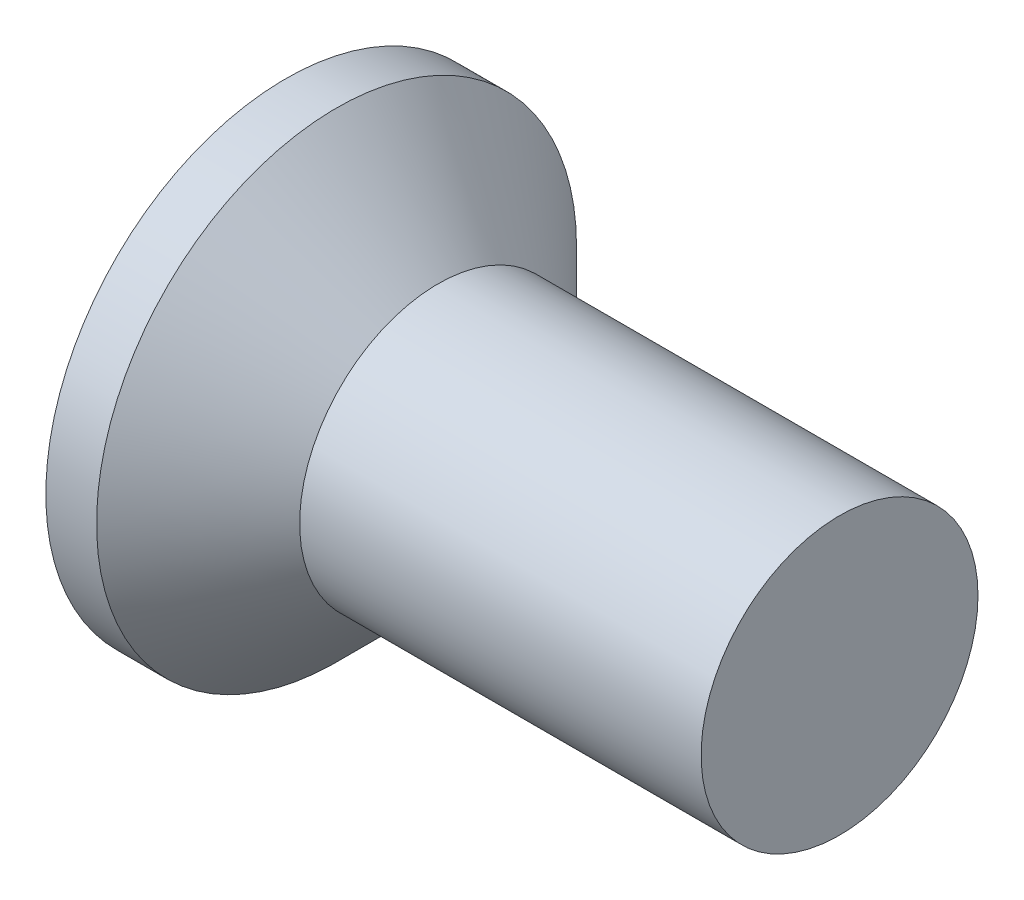
ISO-10303-21;
HEADER;
FILE_DESCRIPTION(('STEP AP214'),'2;1');
FILE_NAME('part.step','',(''),(''),'','','');
FILE_SCHEMA(('AUTOMOTIVE_DESIGN { 1 0 10303 214 1 1 1 1 }'));
ENDSEC;
DATA;
#1=APPLICATION_CONTEXT('core data for automotive mechanical design processes');
#2=APPLICATION_PROTOCOL_DEFINITION('international standard','automotive_design',2000,#1);
#3=PRODUCT_CONTEXT('',#1,'mechanical');
#4=PRODUCT('Part','Part','',(#3));
#5=PRODUCT_RELATED_PRODUCT_CATEGORY('part','',(#4));
#6=PRODUCT_DEFINITION_FORMATION('','',#4);
#7=PRODUCT_DEFINITION_CONTEXT('part definition',#1,'design');
#8=PRODUCT_DEFINITION('design','',#6,#7);
#9=PRODUCT_DEFINITION_SHAPE('','',#8);
#10=(LENGTH_UNIT() NAMED_UNIT(*) SI_UNIT(.MILLI.,.METRE.));
#11=(NAMED_UNIT(*) PLANE_ANGLE_UNIT() SI_UNIT($,.RADIAN.));
#12=(NAMED_UNIT(*) SI_UNIT($,.STERADIAN.) SOLID_ANGLE_UNIT());
#13=UNCERTAINTY_MEASURE_WITH_UNIT(LENGTH_MEASURE(1.E-05),#10,'distance_accuracy_value','');
#14=(GEOMETRIC_REPRESENTATION_CONTEXT(3) GLOBAL_UNCERTAINTY_ASSIGNED_CONTEXT((#13)) GLOBAL_UNIT_ASSIGNED_CONTEXT((#10,
#11,#12)) REPRESENTATION_CONTEXT('',''));
#15=CARTESIAN_POINT('',(0.,0.,0.));
#16=DIRECTION('',(0.,0.,1.));
#17=DIRECTION('',(1.,0.,0.));
#18=AXIS2_PLACEMENT_3D('',#15,#16,#17);
#19=CARTESIAN_POINT('',(0.,2.6,0.));
#20=DIRECTION('',(-1.,0.,0.));
#21=DIRECTION('',(0.,0.,1.));
#22=AXIS2_PLACEMENT_3D('',#19,#20,#21);
#23=PLANE('',#22);
#24=CARTESIAN_POINT('',(0.,0.,0.));
#25=DIRECTION('',(1.,0.,0.));
#26=DIRECTION('',(0.,0.,-1.));
#27=AXIS2_PLACEMENT_3D('',#24,#25,#26);
#28=CIRCLE('',#27,2.6);
#29=CARTESIAN_POINT('',(0.,0.,-2.6));
#30=VERTEX_POINT('',#29);
#31=EDGE_CURVE('E182',#30,#30,#28,.T.);
#32=ORIENTED_EDGE('',*,*,#31,.F.);
#33=EDGE_LOOP('',(#32));
#34=FACE_BOUND('',#33,.T.);
#35=DIRECTION('',(0.,1.,0.));
#36=VECTOR('',#35,1.);
#37=CARTESIAN_POINT('',(0.,-0.32,-0.32));
#38=LINE('',#37,#36);
#39=CARTESIAN_POINT('',(0.,-1.6,-0.32));
#40=VERTEX_POINT('',#39);
#41=CARTESIAN_POINT('',(0.,-0.62,-0.32));
#42=VERTEX_POINT('',#41);
#43=EDGE_CURVE('E308',#40,#42,#38,.T.);
#44=ORIENTED_EDGE('',*,*,#43,.T.);
#45=CARTESIAN_POINT('',(0.,-0.62,-0.62));
#46=DIRECTION('',(-1.,0.,0.));
#47=DIRECTION('',(0.,0.,1.));
#48=AXIS2_PLACEMENT_3D('',#45,#46,#47);
#49=CIRCLE('',#48,0.3);
#50=CARTESIAN_POINT('',(0.,-0.32,-0.62));
#51=VERTEX_POINT('',#50);
#52=EDGE_CURVE('E187',#42,#51,#49,.T.);
#53=ORIENTED_EDGE('',*,*,#52,.T.);
#54=DIRECTION('',(0.,0.,-1.));
#55=VECTOR('',#54,1.);
#56=CARTESIAN_POINT('',(0.,-0.32,-0.32));
#57=LINE('',#56,#55);
#58=CARTESIAN_POINT('',(0.,-0.32,-1.6));
#59=VERTEX_POINT('',#58);
#60=EDGE_CURVE('E310',#51,#59,#57,.T.);
#61=ORIENTED_EDGE('',*,*,#60,.T.);
#62=DIRECTION('',(0.,1.,0.));
#63=VECTOR('',#62,1.);
#64=CARTESIAN_POINT('',(0.,0.32,-1.6));
#65=LINE('',#64,#63);
#66=CARTESIAN_POINT('',(0.,0.32,-1.6));
#67=VERTEX_POINT('',#66);
#68=EDGE_CURVE('E312',#59,#67,#65,.T.);
#69=ORIENTED_EDGE('',*,*,#68,.T.);
#70=DIRECTION('',(0.,0.,1.));
#71=VECTOR('',#70,1.);
#72=CARTESIAN_POINT('',(0.,0.32,-0.32));
#73=LINE('',#72,#71);
#74=CARTESIAN_POINT('',(0.,0.32,-0.62));
#75=VERTEX_POINT('',#74);
#76=EDGE_CURVE('E315',#67,#75,#73,.T.);
#77=ORIENTED_EDGE('',*,*,#76,.T.);
#78=CARTESIAN_POINT('',(0.,0.62,-0.62));
#79=DIRECTION('',(-1.,0.,0.));
#80=DIRECTION('',(0.,0.,1.));
#81=AXIS2_PLACEMENT_3D('',#78,#79,#80);
#82=CIRCLE('',#81,0.3);
#83=CARTESIAN_POINT('',(0.,0.62,-0.32));
#84=VERTEX_POINT('',#83);
#85=EDGE_CURVE('E185',#75,#84,#82,.T.);
#86=ORIENTED_EDGE('',*,*,#85,.T.);
#87=DIRECTION('',(0.,1.,0.));
#88=VECTOR('',#87,1.);
#89=CARTESIAN_POINT('',(0.,0.32,-0.32));
#90=LINE('',#89,#88);
#91=CARTESIAN_POINT('',(0.,1.6,-0.32));
#92=VERTEX_POINT('',#91);
#93=EDGE_CURVE('E318',#84,#92,#90,.T.);
#94=ORIENTED_EDGE('',*,*,#93,.T.);
#95=DIRECTION('',(0.,0.,1.));
#96=VECTOR('',#95,1.);
#97=CARTESIAN_POINT('',(0.,1.6,-0.32));
#98=LINE('',#97,#96);
#99=CARTESIAN_POINT('',(0.,1.6,0.32));
#100=VERTEX_POINT('',#99);
#101=EDGE_CURVE('E320',#92,#100,#98,.T.);
#102=ORIENTED_EDGE('',*,*,#101,.T.);
#103=DIRECTION('',(0.,-1.,0.));
#104=VECTOR('',#103,1.);
#105=CARTESIAN_POINT('',(0.,0.32,0.32));
#106=LINE('',#105,#104);
#107=CARTESIAN_POINT('',(0.,0.62,0.32));
#108=VERTEX_POINT('',#107);
#109=EDGE_CURVE('E323',#100,#108,#106,.T.);
#110=ORIENTED_EDGE('',*,*,#109,.T.);
#111=CARTESIAN_POINT('',(0.,0.62,0.62));
#112=DIRECTION('',(-1.,0.,0.));
#113=DIRECTION('',(0.,0.,1.));
#114=AXIS2_PLACEMENT_3D('',#111,#112,#113);
#115=CIRCLE('',#114,0.3);
#116=CARTESIAN_POINT('',(0.,0.32,0.62));
#117=VERTEX_POINT('',#116);
#118=EDGE_CURVE('E150',#108,#117,#115,.T.);
#119=ORIENTED_EDGE('',*,*,#118,.T.);
#120=DIRECTION('',(0.,0.,1.));
#121=VECTOR('',#120,1.);
#122=CARTESIAN_POINT('',(0.,0.32,0.32));
#123=LINE('',#122,#121);
#124=CARTESIAN_POINT('',(0.,0.32,1.6));
#125=VERTEX_POINT('',#124);
#126=EDGE_CURVE('E144',#117,#125,#123,.T.);
#127=ORIENTED_EDGE('',*,*,#126,.T.);
#128=DIRECTION('',(0.,-1.,0.));
#129=VECTOR('',#128,1.);
#130=CARTESIAN_POINT('',(0.,0.32,1.6));
#131=LINE('',#130,#129);
#132=CARTESIAN_POINT('',(0.,-0.32,1.6));
#133=VERTEX_POINT('',#132);
#134=EDGE_CURVE('E148',#125,#133,#131,.T.);
#135=ORIENTED_EDGE('',*,*,#134,.T.);
#136=DIRECTION('',(0.,0.,-1.));
#137=VECTOR('',#136,1.);
#138=CARTESIAN_POINT('',(0.,-0.32,0.32));
#139=LINE('',#138,#137);
#140=CARTESIAN_POINT('',(0.,-0.32,0.62));
#141=VERTEX_POINT('',#140);
#142=EDGE_CURVE('E162',#133,#141,#139,.T.);
#143=ORIENTED_EDGE('',*,*,#142,.T.);
#144=CARTESIAN_POINT('',(0.,-0.62,0.62));
#145=DIRECTION('',(-1.,0.,0.));
#146=DIRECTION('',(0.,0.,1.));
#147=AXIS2_PLACEMENT_3D('',#144,#145,#146);
#148=CIRCLE('',#147,0.3);
#149=CARTESIAN_POINT('',(0.,-0.62,0.32));
#150=VERTEX_POINT('',#149);
#151=EDGE_CURVE('E181',#141,#150,#148,.T.);
#152=ORIENTED_EDGE('',*,*,#151,.T.);
#153=DIRECTION('',(0.,-1.,0.));
#154=VECTOR('',#153,1.);
#155=CARTESIAN_POINT('',(0.,-0.32,0.32));
#156=LINE('',#155,#154);
#157=CARTESIAN_POINT('',(0.,-1.6,0.319999999999999));
#158=VERTEX_POINT('',#157);
#159=EDGE_CURVE('E303',#150,#158,#156,.T.);
#160=ORIENTED_EDGE('',*,*,#159,.T.);
#161=DIRECTION('',(0.,0.,-1.));
#162=VECTOR('',#161,1.);
#163=CARTESIAN_POINT('',(0.,-1.6,-0.32));
#164=LINE('',#163,#162);
#165=EDGE_CURVE('E305',#158,#40,#164,.T.);
#166=ORIENTED_EDGE('',*,*,#165,.T.);
#167=EDGE_LOOP('',(#44,#53,#61,#69,#77,#86,#94,#102,#110,#119,#127,#135,#143,#152,#160,#166));
#168=FACE_BOUND('',#167,.T.);
#169=ADVANCED_FACE('F31',(#34,#168),#23,.T.);
#170=CARTESIAN_POINT('',(6.,1.5,0.));
#171=DIRECTION('',(1.,0.,0.));
#172=DIRECTION('',(0.,0.,-1.));
#173=AXIS2_PLACEMENT_3D('',#170,#171,#172);
#174=PLANE('',#173);
#175=CARTESIAN_POINT('',(6.,0.,0.));
#176=DIRECTION('',(1.,0.,0.));
#177=DIRECTION('',(0.,0.,-1.));
#178=AXIS2_PLACEMENT_3D('',#175,#176,#177);
#179=CIRCLE('',#178,1.5);
#180=CARTESIAN_POINT('',(6.,0.,-1.5));
#181=VERTEX_POINT('',#180);
#182=EDGE_CURVE('E168',#181,#181,#179,.T.);
#183=ORIENTED_EDGE('',*,*,#182,.T.);
#184=EDGE_LOOP('',(#183));
#185=FACE_BOUND('',#184,.T.);
#186=ADVANCED_FACE('F235',(#185),#174,.T.);
#187=CARTESIAN_POINT('',(4.51581291088132,0.,0.));
#188=DIRECTION('',(1.,0.,0.));
#189=DIRECTION('',(0.,0.,-1.));
#190=AXIS2_PLACEMENT_3D('',#187,#188,#189);
#191=CYLINDRICAL_SURFACE('',#190,2.6);
#192=ORIENTED_EDGE('',*,*,#31,.T.);
#193=EDGE_LOOP('',(#192));
#194=FACE_BOUND('',#193,.T.);
#195=CARTESIAN_POINT('',(0.550000000000004,0.,0.));
#196=DIRECTION('',(1.,0.,0.));
#197=DIRECTION('',(0.,0.,-1.));
#198=AXIS2_PLACEMENT_3D('',#195,#196,#197);
#199=CIRCLE('',#198,2.6);
#200=CARTESIAN_POINT('',(0.550000000000004,0.,-2.6));
#201=VERTEX_POINT('',#200);
#202=EDGE_CURVE('E327',#201,#201,#199,.T.);
#203=ORIENTED_EDGE('',*,*,#202,.F.);
#204=EDGE_LOOP('',(#203));
#205=FACE_BOUND('',#204,.T.);
#206=ADVANCED_FACE('F241',(#194,#205),#191,.T.);
#207=CARTESIAN_POINT('',(1.65,0.,0.));
#208=DIRECTION('',(-1.,0.,0.));
#209=DIRECTION('',(0.,0.,1.));
#210=AXIS2_PLACEMENT_3D('',#207,#208,#209);
#211=CONICAL_SURFACE('',#210,1.5,0.78539816339745);
#212=ORIENTED_EDGE('',*,*,#202,.T.);
#213=EDGE_LOOP('',(#212));
#214=FACE_BOUND('',#213,.T.);
#215=CARTESIAN_POINT('',(1.65,0.,0.));
#216=DIRECTION('',(1.,0.,0.));
#217=DIRECTION('',(0.,0.,-1.));
#218=AXIS2_PLACEMENT_3D('',#215,#216,#217);
#219=CIRCLE('',#218,1.5);
#220=CARTESIAN_POINT('',(1.65,0.,-1.5));
#221=VERTEX_POINT('',#220);
#222=EDGE_CURVE('E171',#221,#221,#219,.T.);
#223=ORIENTED_EDGE('',*,*,#222,.F.);
#224=EDGE_LOOP('',(#223));
#225=FACE_BOUND('',#224,.T.);
#226=ADVANCED_FACE('F363',(#214,#225),#211,.T.);
#227=CARTESIAN_POINT('',(4.51581291088132,0.,0.));
#228=DIRECTION('',(1.,0.,0.));
#229=DIRECTION('',(0.,0.,-1.));
#230=AXIS2_PLACEMENT_3D('',#227,#228,#229);
#231=CYLINDRICAL_SURFACE('',#230,1.5);
#232=ORIENTED_EDGE('',*,*,#222,.T.);
#233=EDGE_LOOP('',(#232));
#234=FACE_BOUND('',#233,.T.);
#235=ORIENTED_EDGE('',*,*,#182,.F.);
#236=EDGE_LOOP('',(#235));
#237=FACE_BOUND('',#236,.T.);
#238=ADVANCED_FACE('F361',(#234,#237),#231,.T.);
#239=CARTESIAN_POINT('',(0.825,0.32,0.32));
#240=DIRECTION('',(0.,-1.,0.));
#241=DIRECTION('',(0.,0.,-1.));
#242=AXIS2_PLACEMENT_3D('',#239,#240,#241);
#243=PLANE('',#242);
#244=ORIENTED_EDGE('',*,*,#126,.F.);
#245=DIRECTION('',(-1.,0.,0.));
#246=VECTOR('',#245,1.);
#247=CARTESIAN_POINT('',(0.825,0.32,0.62));
#248=LINE('',#247,#246);
#249=CARTESIAN_POINT('',(0.825,0.32,0.62));
#250=VERTEX_POINT('',#249);
#251=EDGE_CURVE('E199',#117,#250,#248,.F.);
#252=ORIENTED_EDGE('',*,*,#251,.T.);
#253=DIRECTION('',(0.,0.,1.));
#254=VECTOR('',#253,1.);
#255=CARTESIAN_POINT('',(0.825,0.32,0.32));
#256=LINE('',#255,#254);
#257=CARTESIAN_POINT('',(0.825,0.32,1.12368602791856));
#258=VERTEX_POINT('',#257);
#259=EDGE_CURVE('E166',#250,#258,#256,.T.);
#260=ORIENTED_EDGE('',*,*,#259,.T.);
#261=DIRECTION('',(-0.866025403784438,0.,0.500000000000001));
#262=VECTOR('',#261,1.);
#263=CARTESIAN_POINT('',(0.,0.32,1.6));
#264=LINE('',#263,#262);
#265=EDGE_CURVE('E158',#258,#125,#264,.T.);
#266=ORIENTED_EDGE('',*,*,#265,.T.);
#267=EDGE_LOOP('',(#244,#252,#260,#266));
#268=FACE_BOUND('',#267,.T.);
#269=ADVANCED_FACE('F164',(#268),#243,.T.);
#270=CARTESIAN_POINT('',(0.,0.32,1.6));
#271=DIRECTION('',(-0.500000000000001,0.,-0.866025403784438));
#272=DIRECTION('',(-0.866025403784438,0.,0.500000000000001));
#273=AXIS2_PLACEMENT_3D('',#270,#271,#272);
#274=PLANE('',#273);
#275=ORIENTED_EDGE('',*,*,#134,.F.);
#276=ORIENTED_EDGE('',*,*,#265,.F.);
#277=DIRECTION('',(0.,-1.,0.));
#278=VECTOR('',#277,1.);
#279=CARTESIAN_POINT('',(0.825,0.32,1.12368602791856));
#280=LINE('',#279,#278);
#281=CARTESIAN_POINT('',(0.825,-0.32,1.12368602791856));
#282=VERTEX_POINT('',#281);
#283=EDGE_CURVE('E177',#258,#282,#280,.T.);
#284=ORIENTED_EDGE('',*,*,#283,.T.);
#285=DIRECTION('',(-0.866025403784438,0.,0.500000000000001));
#286=VECTOR('',#285,1.);
#287=CARTESIAN_POINT('',(1.17300625842204,-0.32,0.922764520938917));
#288=LINE('',#287,#286);
#289=EDGE_CURVE('E160',#282,#133,#288,.T.);
#290=ORIENTED_EDGE('',*,*,#289,.T.);
#291=EDGE_LOOP('',(#275,#276,#284,#290));
#292=FACE_BOUND('',#291,.T.);
#293=ADVANCED_FACE('F157',(#292),#274,.T.);
#294=CARTESIAN_POINT('',(0.825,-0.32,0.32));
#295=DIRECTION('',(0.,1.,0.));
#296=DIRECTION('',(0.,0.,1.));
#297=AXIS2_PLACEMENT_3D('',#294,#295,#296);
#298=PLANE('',#297);
#299=DIRECTION('',(0.,0.,-1.));
#300=VECTOR('',#299,1.);
#301=CARTESIAN_POINT('',(0.825,-0.32,0.32));
#302=LINE('',#301,#300);
#303=CARTESIAN_POINT('',(0.825,-0.32,0.62));
#304=VERTEX_POINT('',#303);
#305=EDGE_CURVE('E349',#282,#304,#302,.T.);
#306=ORIENTED_EDGE('',*,*,#305,.T.);
#307=DIRECTION('',(-1.,0.,0.));
#308=VECTOR('',#307,1.);
#309=CARTESIAN_POINT('',(0.825,-0.32,0.62));
#310=LINE('',#309,#308);
#311=EDGE_CURVE('E201',#304,#141,#310,.T.);
#312=ORIENTED_EDGE('',*,*,#311,.T.);
#313=ORIENTED_EDGE('',*,*,#142,.F.);
#314=ORIENTED_EDGE('',*,*,#289,.F.);
#315=EDGE_LOOP('',(#306,#312,#313,#314));
#316=FACE_BOUND('',#315,.T.);
#317=ADVANCED_FACE('F255',(#316),#298,.T.);
#318=CARTESIAN_POINT('',(0.825,-0.32,0.32));
#319=DIRECTION('',(0.,0.,-1.));
#320=DIRECTION('',(0.,1.,0.));
#321=AXIS2_PLACEMENT_3D('',#318,#319,#320);
#322=PLANE('',#321);
#323=ORIENTED_EDGE('',*,*,#159,.F.);
#324=DIRECTION('',(-1.,0.,0.));
#325=VECTOR('',#324,1.);
#326=CARTESIAN_POINT('',(0.825,-0.62,0.32));
#327=LINE('',#326,#325);
#328=CARTESIAN_POINT('',(0.825,-0.62,0.32));
#329=VERTEX_POINT('',#328);
#330=EDGE_CURVE('E46',#150,#329,#327,.F.);
#331=ORIENTED_EDGE('',*,*,#330,.T.);
#332=DIRECTION('',(0.,-1.,0.));
#333=VECTOR('',#332,1.);
#334=CARTESIAN_POINT('',(0.825,-0.32,0.32));
#335=LINE('',#334,#333);
#336=CARTESIAN_POINT('',(0.825,-1.12368602791856,0.32));
#337=VERTEX_POINT('',#336);
#338=EDGE_CURVE('E292',#329,#337,#335,.T.);
#339=ORIENTED_EDGE('',*,*,#338,.T.);
#340=DIRECTION('',(-0.866025403784438,-0.500000000000001,0.));
#341=VECTOR('',#340,1.);
#342=CARTESIAN_POINT('',(0.,-1.6,0.319999999999999));
#343=LINE('',#342,#341);
#344=EDGE_CURVE('E173',#337,#158,#343,.T.);
#345=ORIENTED_EDGE('',*,*,#344,.T.);
#346=EDGE_LOOP('',(#323,#331,#339,#345));
#347=FACE_BOUND('',#346,.T.);
#348=ADVANCED_FACE('F260',(#347),#322,.T.);
#349=CARTESIAN_POINT('',(0.,-1.6,-0.32));
#350=DIRECTION('',(-0.500000000000001,0.866025403784438,0.));
#351=DIRECTION('',(-0.866025403784438,-0.500000000000001,0.));
#352=AXIS2_PLACEMENT_3D('',#349,#350,#351);
#353=PLANE('',#352);
#354=ORIENTED_EDGE('',*,*,#165,.F.);
#355=ORIENTED_EDGE('',*,*,#344,.F.);
#356=DIRECTION('',(0.,0.,-1.));
#357=VECTOR('',#356,1.);
#358=CARTESIAN_POINT('',(0.825,-1.12368602791856,-0.32));
#359=LINE('',#358,#357);
#360=CARTESIAN_POINT('',(0.825,-1.12368602791856,-0.32));
#361=VERTEX_POINT('',#360);
#362=EDGE_CURVE('E288',#337,#361,#359,.T.);
#363=ORIENTED_EDGE('',*,*,#362,.T.);
#364=DIRECTION('',(-0.866025403784438,-0.500000000000001,0.));
#365=VECTOR('',#364,1.);
#366=CARTESIAN_POINT('',(1.17300625842204,-0.922764520938917,-0.32));
#367=LINE('',#366,#365);
#368=EDGE_CURVE('E287',#361,#40,#367,.T.);
#369=ORIENTED_EDGE('',*,*,#368,.T.);
#370=EDGE_LOOP('',(#354,#355,#363,#369));
#371=FACE_BOUND('',#370,.T.);
#372=ADVANCED_FACE('F256',(#371),#353,.T.);
#373=CARTESIAN_POINT('',(0.825,-0.32,-0.32));
#374=DIRECTION('',(0.,0.,1.));
#375=DIRECTION('',(1.,0.,0.));
#376=AXIS2_PLACEMENT_3D('',#373,#374,#375);
#377=PLANE('',#376);
#378=DIRECTION('',(0.,1.,0.));
#379=VECTOR('',#378,1.);
#380=CARTESIAN_POINT('',(0.825,-0.32,-0.32));
#381=LINE('',#380,#379);
#382=CARTESIAN_POINT('',(0.825,-0.62,-0.32));
#383=VERTEX_POINT('',#382);
#384=EDGE_CURVE('E281',#361,#383,#381,.T.);
#385=ORIENTED_EDGE('',*,*,#384,.T.);
#386=DIRECTION('',(-1.,0.,0.));
#387=VECTOR('',#386,1.);
#388=CARTESIAN_POINT('',(0.825,-0.62,-0.32));
#389=LINE('',#388,#387);
#390=EDGE_CURVE('E178',#383,#42,#389,.T.);
#391=ORIENTED_EDGE('',*,*,#390,.T.);
#392=ORIENTED_EDGE('',*,*,#43,.F.);
#393=ORIENTED_EDGE('',*,*,#368,.F.);
#394=EDGE_LOOP('',(#385,#391,#392,#393));
#395=FACE_BOUND('',#394,.T.);
#396=ADVANCED_FACE('F259',(#395),#377,.T.);
#397=CARTESIAN_POINT('',(0.825,-0.32,-0.32));
#398=DIRECTION('',(0.,1.,0.));
#399=DIRECTION('',(0.,0.,1.));
#400=AXIS2_PLACEMENT_3D('',#397,#398,#399);
#401=PLANE('',#400);
#402=ORIENTED_EDGE('',*,*,#60,.F.);
#403=DIRECTION('',(-1.,0.,0.));
#404=VECTOR('',#403,1.);
#405=CARTESIAN_POINT('',(0.825,-0.32,-0.62));
#406=LINE('',#405,#404);
#407=CARTESIAN_POINT('',(0.825,-0.32,-0.62));
#408=VERTEX_POINT('',#407);
#409=EDGE_CURVE('E189',#51,#408,#406,.F.);
#410=ORIENTED_EDGE('',*,*,#409,.T.);
#411=DIRECTION('',(0.,0.,-1.));
#412=VECTOR('',#411,1.);
#413=CARTESIAN_POINT('',(0.825,-0.32,-0.32));
#414=LINE('',#413,#412);
#415=CARTESIAN_POINT('',(0.825,-0.32,-1.12368602791856));
#416=VERTEX_POINT('',#415);
#417=EDGE_CURVE('E283',#408,#416,#414,.T.);
#418=ORIENTED_EDGE('',*,*,#417,.T.);
#419=DIRECTION('',(-0.866025403784438,0.,-0.500000000000001));
#420=VECTOR('',#419,1.);
#421=CARTESIAN_POINT('',(0.,-0.32,-1.6));
#422=LINE('',#421,#420);
#423=EDGE_CURVE('E339',#416,#59,#422,.T.);
#424=ORIENTED_EDGE('',*,*,#423,.T.);
#425=EDGE_LOOP('',(#402,#410,#418,#424));
#426=FACE_BOUND('',#425,.T.);
#427=ADVANCED_FACE('F266',(#426),#401,.T.);
#428=CARTESIAN_POINT('',(0.,0.32,-1.6));
#429=DIRECTION('',(-0.500000000000001,0.,0.866025403784438));
#430=DIRECTION('',(0.866025403784438,0.,0.500000000000001));
#431=AXIS2_PLACEMENT_3D('',#428,#429,#430);
#432=PLANE('',#431);
#433=ORIENTED_EDGE('',*,*,#68,.F.);
#434=ORIENTED_EDGE('',*,*,#423,.F.);
#435=DIRECTION('',(0.,1.,0.));
#436=VECTOR('',#435,1.);
#437=CARTESIAN_POINT('',(0.825,0.32,-1.12368602791856));
#438=LINE('',#437,#436);
#439=CARTESIAN_POINT('',(0.825,0.32,-1.12368602791856));
#440=VERTEX_POINT('',#439);
#441=EDGE_CURVE('E290',#416,#440,#438,.T.);
#442=ORIENTED_EDGE('',*,*,#441,.T.);
#443=DIRECTION('',(-0.866025403784438,0.,-0.500000000000001));
#444=VECTOR('',#443,1.);
#445=CARTESIAN_POINT('',(1.17300625842204,0.32,-0.922764520938918));
#446=LINE('',#445,#444);
#447=EDGE_CURVE('E337',#440,#67,#446,.T.);
#448=ORIENTED_EDGE('',*,*,#447,.T.);
#449=EDGE_LOOP('',(#433,#434,#442,#448));
#450=FACE_BOUND('',#449,.T.);
#451=ADVANCED_FACE('F262',(#450),#432,.T.);
#452=CARTESIAN_POINT('',(0.825,0.32,-0.32));
#453=DIRECTION('',(0.,-1.,0.));
#454=DIRECTION('',(0.,0.,-1.));
#455=AXIS2_PLACEMENT_3D('',#452,#453,#454);
#456=PLANE('',#455);
#457=DIRECTION('',(0.,0.,1.));
#458=VECTOR('',#457,1.);
#459=CARTESIAN_POINT('',(0.825,0.32,-0.32));
#460=LINE('',#459,#458);
#461=CARTESIAN_POINT('',(0.825,0.32,-0.62));
#462=VERTEX_POINT('',#461);
#463=EDGE_CURVE('E297',#440,#462,#460,.T.);
#464=ORIENTED_EDGE('',*,*,#463,.T.);
#465=DIRECTION('',(-1.,0.,0.));
#466=VECTOR('',#465,1.);
#467=CARTESIAN_POINT('',(0.825,0.32,-0.62));
#468=LINE('',#467,#466);
#469=EDGE_CURVE('E191',#462,#75,#468,.T.);
#470=ORIENTED_EDGE('',*,*,#469,.T.);
#471=ORIENTED_EDGE('',*,*,#76,.F.);
#472=ORIENTED_EDGE('',*,*,#447,.F.);
#473=EDGE_LOOP('',(#464,#470,#471,#472));
#474=FACE_BOUND('',#473,.T.);
#475=ADVANCED_FACE('F265',(#474),#456,.T.);
#476=CARTESIAN_POINT('',(0.825,0.32,-0.32));
#477=DIRECTION('',(0.,0.,1.));
#478=DIRECTION('',(1.,0.,0.));
#479=AXIS2_PLACEMENT_3D('',#476,#477,#478);
#480=PLANE('',#479);
#481=ORIENTED_EDGE('',*,*,#93,.F.);
#482=DIRECTION('',(-1.,0.,0.));
#483=VECTOR('',#482,1.);
#484=CARTESIAN_POINT('',(0.825,0.62,-0.32));
#485=LINE('',#484,#483);
#486=CARTESIAN_POINT('',(0.825,0.62,-0.32));
#487=VERTEX_POINT('',#486);
#488=EDGE_CURVE('E194',#84,#487,#485,.F.);
#489=ORIENTED_EDGE('',*,*,#488,.T.);
#490=DIRECTION('',(0.,1.,0.));
#491=VECTOR('',#490,1.);
#492=CARTESIAN_POINT('',(0.825,0.32,-0.32));
#493=LINE('',#492,#491);
#494=CARTESIAN_POINT('',(0.825,1.12368602791856,-0.32));
#495=VERTEX_POINT('',#494);
#496=EDGE_CURVE('E300',#487,#495,#493,.T.);
#497=ORIENTED_EDGE('',*,*,#496,.T.);
#498=DIRECTION('',(-0.866025403784438,0.500000000000001,0.));
#499=VECTOR('',#498,1.);
#500=CARTESIAN_POINT('',(0.,1.6,-0.32));
#501=LINE('',#500,#499);
#502=EDGE_CURVE('E333',#495,#92,#501,.T.);
#503=ORIENTED_EDGE('',*,*,#502,.T.);
#504=EDGE_LOOP('',(#481,#489,#497,#503));
#505=FACE_BOUND('',#504,.T.);
#506=ADVANCED_FACE('F251',(#505),#480,.T.);
#507=CARTESIAN_POINT('',(0.,1.6,-0.32));
#508=DIRECTION('',(-0.500000000000001,-0.866025403784438,0.));
#509=DIRECTION('',(0.866025403784438,-0.500000000000001,0.));
#510=AXIS2_PLACEMENT_3D('',#507,#508,#509);
#511=PLANE('',#510);
#512=ORIENTED_EDGE('',*,*,#101,.F.);
#513=ORIENTED_EDGE('',*,*,#502,.F.);
#514=DIRECTION('',(0.,0.,1.));
#515=VECTOR('',#514,1.);
#516=CARTESIAN_POINT('',(0.825,1.12368602791856,-0.32));
#517=LINE('',#516,#515);
#518=CARTESIAN_POINT('',(0.825,1.12368602791856,0.32));
#519=VERTEX_POINT('',#518);
#520=EDGE_CURVE('E221',#495,#519,#517,.T.);
#521=ORIENTED_EDGE('',*,*,#520,.T.);
#522=DIRECTION('',(-0.866025403784438,0.500000000000001,0.));
#523=VECTOR('',#522,1.);
#524=CARTESIAN_POINT('',(1.17300625842204,0.922764520938917,0.32));
#525=LINE('',#524,#523);
#526=EDGE_CURVE('E220',#519,#100,#525,.T.);
#527=ORIENTED_EDGE('',*,*,#526,.T.);
#528=EDGE_LOOP('',(#512,#513,#521,#527));
#529=FACE_BOUND('',#528,.T.);
#530=ADVANCED_FACE('F248',(#529),#511,.T.);
#531=CARTESIAN_POINT('',(0.825,0.32,0.32));
#532=DIRECTION('',(0.,0.,-1.));
#533=DIRECTION('',(0.,1.,0.));
#534=AXIS2_PLACEMENT_3D('',#531,#532,#533);
#535=PLANE('',#534);
#536=DIRECTION('',(0.,-1.,0.));
#537=VECTOR('',#536,1.);
#538=CARTESIAN_POINT('',(0.825,0.32,0.32));
#539=LINE('',#538,#537);
#540=CARTESIAN_POINT('',(0.825,0.62,0.32));
#541=VERTEX_POINT('',#540);
#542=EDGE_CURVE('E213',#519,#541,#539,.T.);
#543=ORIENTED_EDGE('',*,*,#542,.T.);
#544=DIRECTION('',(-1.,0.,0.));
#545=VECTOR('',#544,1.);
#546=CARTESIAN_POINT('',(0.825,0.62,0.32));
#547=LINE('',#546,#545);
#548=EDGE_CURVE('E196',#541,#108,#547,.T.);
#549=ORIENTED_EDGE('',*,*,#548,.T.);
#550=ORIENTED_EDGE('',*,*,#109,.F.);
#551=ORIENTED_EDGE('',*,*,#526,.F.);
#552=EDGE_LOOP('',(#543,#549,#550,#551));
#553=FACE_BOUND('',#552,.T.);
#554=ADVANCED_FACE('F218',(#553),#535,.T.);
#555=CARTESIAN_POINT('',(0.825,0.32,0.32));
#556=DIRECTION('',(1.,0.,0.));
#557=DIRECTION('',(0.,0.,-1.));
#558=AXIS2_PLACEMENT_3D('',#555,#556,#557);
#559=PLANE('',#558);
#560=ORIENTED_EDGE('',*,*,#259,.F.);
#561=CARTESIAN_POINT('',(0.825,0.62,0.62));
#562=DIRECTION('',(1.,0.,0.));
#563=DIRECTION('',(0.,0.,-1.));
#564=AXIS2_PLACEMENT_3D('',#561,#562,#563);
#565=CIRCLE('',#564,0.3);
#566=EDGE_CURVE('E39',#250,#541,#565,.T.);
#567=ORIENTED_EDGE('',*,*,#566,.T.);
#568=ORIENTED_EDGE('',*,*,#542,.F.);
#569=ORIENTED_EDGE('',*,*,#520,.F.);
#570=ORIENTED_EDGE('',*,*,#496,.F.);
#571=CARTESIAN_POINT('',(0.825,0.62,-0.62));
#572=DIRECTION('',(1.,0.,0.));
#573=DIRECTION('',(0.,0.,-1.));
#574=AXIS2_PLACEMENT_3D('',#571,#572,#573);
#575=CIRCLE('',#574,0.3);
#576=EDGE_CURVE('E207',#487,#462,#575,.T.);
#577=ORIENTED_EDGE('',*,*,#576,.T.);
#578=ORIENTED_EDGE('',*,*,#463,.F.);
#579=ORIENTED_EDGE('',*,*,#441,.F.);
#580=ORIENTED_EDGE('',*,*,#417,.F.);
#581=CARTESIAN_POINT('',(0.825,-0.62,-0.62));
#582=DIRECTION('',(1.,0.,0.));
#583=DIRECTION('',(0.,0.,-1.));
#584=AXIS2_PLACEMENT_3D('',#581,#582,#583);
#585=CIRCLE('',#584,0.3);
#586=EDGE_CURVE('E205',#408,#383,#585,.T.);
#587=ORIENTED_EDGE('',*,*,#586,.T.);
#588=ORIENTED_EDGE('',*,*,#384,.F.);
#589=ORIENTED_EDGE('',*,*,#362,.F.);
#590=ORIENTED_EDGE('',*,*,#338,.F.);
#591=CARTESIAN_POINT('',(0.825,-0.62,0.62));
#592=DIRECTION('',(1.,0.,0.));
#593=DIRECTION('',(0.,0.,-1.));
#594=AXIS2_PLACEMENT_3D('',#591,#592,#593);
#595=CIRCLE('',#594,0.3);
#596=EDGE_CURVE('E11',#329,#304,#595,.T.);
#597=ORIENTED_EDGE('',*,*,#596,.T.);
#598=ORIENTED_EDGE('',*,*,#305,.F.);
#599=ORIENTED_EDGE('',*,*,#283,.F.);
#600=EDGE_LOOP('',(#560,#567,#568,#569,#570,#577,#578,#579,#580,#587,#588,#589,#590,#597,#598,#599));
#601=FACE_BOUND('',#600,.T.);
#602=ADVANCED_FACE('F211',(#601),#559,.F.);
#603=CARTESIAN_POINT('',(0.825,-0.62,-0.62));
#604=DIRECTION('',(-1.,0.,0.));
#605=DIRECTION('',(0.,0.,1.));
#606=AXIS2_PLACEMENT_3D('',#603,#604,#605);
#607=CYLINDRICAL_SURFACE('',#606,0.3);
#608=ORIENTED_EDGE('',*,*,#586,.F.);
#609=ORIENTED_EDGE('',*,*,#409,.F.);
#610=ORIENTED_EDGE('',*,*,#52,.F.);
#611=ORIENTED_EDGE('',*,*,#390,.F.);
#612=EDGE_LOOP('',(#608,#609,#610,#611));
#613=FACE_BOUND('',#612,.T.);
#614=ADVANCED_FACE('F231',(#613),#607,.T.);
#615=CARTESIAN_POINT('',(0.825,0.62,-0.62));
#616=DIRECTION('',(-1.,0.,0.));
#617=DIRECTION('',(0.,0.,1.));
#618=AXIS2_PLACEMENT_3D('',#615,#616,#617);
#619=CYLINDRICAL_SURFACE('',#618,0.3);
#620=ORIENTED_EDGE('',*,*,#576,.F.);
#621=ORIENTED_EDGE('',*,*,#488,.F.);
#622=ORIENTED_EDGE('',*,*,#85,.F.);
#623=ORIENTED_EDGE('',*,*,#469,.F.);
#624=EDGE_LOOP('',(#620,#621,#622,#623));
#625=FACE_BOUND('',#624,.T.);
#626=ADVANCED_FACE('F225',(#625),#619,.T.);
#627=CARTESIAN_POINT('',(0.825,0.62,0.62));
#628=DIRECTION('',(-1.,0.,0.));
#629=DIRECTION('',(0.,0.,1.));
#630=AXIS2_PLACEMENT_3D('',#627,#628,#629);
#631=CYLINDRICAL_SURFACE('',#630,0.3);
#632=ORIENTED_EDGE('',*,*,#566,.F.);
#633=ORIENTED_EDGE('',*,*,#251,.F.);
#634=ORIENTED_EDGE('',*,*,#118,.F.);
#635=ORIENTED_EDGE('',*,*,#548,.F.);
#636=EDGE_LOOP('',(#632,#633,#634,#635));
#637=FACE_BOUND('',#636,.T.);
#638=ADVANCED_FACE('F223',(#637),#631,.T.);
#639=CARTESIAN_POINT('',(0.825,-0.62,0.62));
#640=DIRECTION('',(-1.,0.,0.));
#641=DIRECTION('',(0.,0.,1.));
#642=AXIS2_PLACEMENT_3D('',#639,#640,#641);
#643=CYLINDRICAL_SURFACE('',#642,0.3);
#644=ORIENTED_EDGE('',*,*,#596,.F.);
#645=ORIENTED_EDGE('',*,*,#330,.F.);
#646=ORIENTED_EDGE('',*,*,#151,.F.);
#647=ORIENTED_EDGE('',*,*,#311,.F.);
#648=EDGE_LOOP('',(#644,#645,#646,#647));
#649=FACE_BOUND('',#648,.T.);
#650=ADVANCED_FACE('F33',(#649),#643,.T.);
#651=CLOSED_SHELL('',(#169,#186,#206,#226,#238,#269,#293,#317,#348,#372,#396,#427,#451,#475,
#506,#530,#554,#602,#614,#626,#638,#650));
#652=MANIFOLD_SOLID_BREP('B2',#651);
#653=ADVANCED_BREP_SHAPE_REPRESENTATION('',(#18,#652),#14);
#654=SHAPE_DEFINITION_REPRESENTATION(#9,#653);
ENDSEC;
END-ISO-10303-21;
